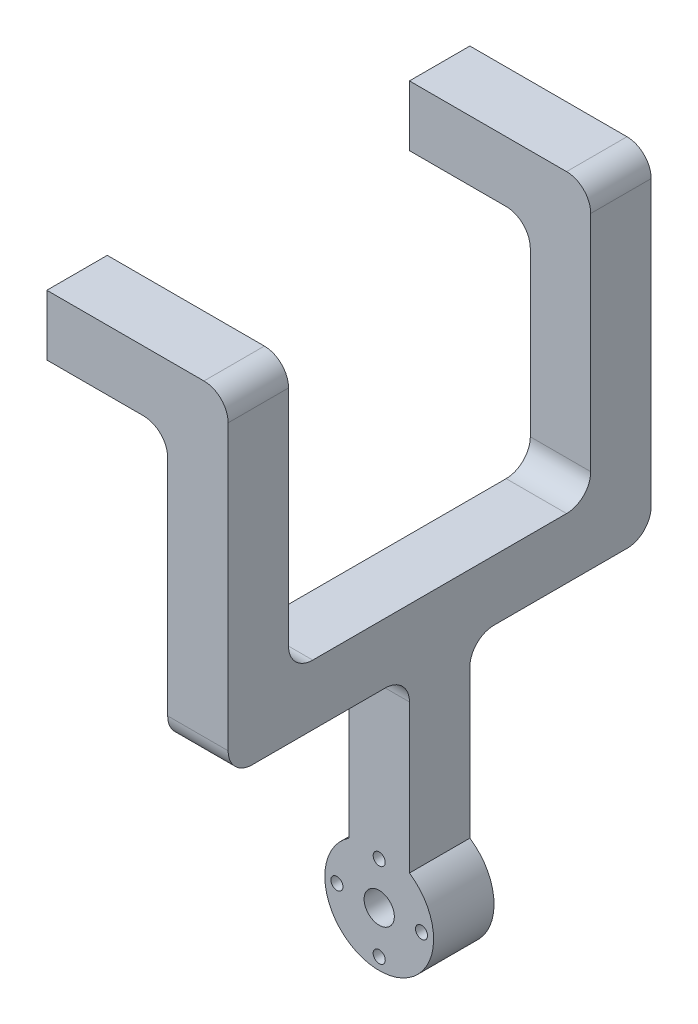
ISO-10303-21;
HEADER;
FILE_DESCRIPTION(('STEP AP214'),'2;1');
FILE_NAME('part.step','',(''),(''),'','','');
FILE_SCHEMA(('AUTOMOTIVE_DESIGN { 1 0 10303 214 1 1 1 1 }'));
ENDSEC;
DATA;
#1=APPLICATION_CONTEXT('core data for automotive mechanical design processes');
#2=APPLICATION_PROTOCOL_DEFINITION('international standard','automotive_design',2000,#1);
#3=PRODUCT_CONTEXT('',#1,'mechanical');
#4=PRODUCT('Part','Part','',(#3));
#5=PRODUCT_RELATED_PRODUCT_CATEGORY('part','',(#4));
#6=PRODUCT_DEFINITION_FORMATION('','',#4);
#7=PRODUCT_DEFINITION_CONTEXT('part definition',#1,'design');
#8=PRODUCT_DEFINITION('design','',#6,#7);
#9=PRODUCT_DEFINITION_SHAPE('','',#8);
#10=(LENGTH_UNIT() NAMED_UNIT(*) SI_UNIT(.MILLI.,.METRE.));
#11=(NAMED_UNIT(*) PLANE_ANGLE_UNIT() SI_UNIT($,.RADIAN.));
#12=(NAMED_UNIT(*) SI_UNIT($,.STERADIAN.) SOLID_ANGLE_UNIT());
#13=UNCERTAINTY_MEASURE_WITH_UNIT(LENGTH_MEASURE(1.E-05),#10,'distance_accuracy_value','');
#14=(GEOMETRIC_REPRESENTATION_CONTEXT(3) GLOBAL_UNCERTAINTY_ASSIGNED_CONTEXT((#13)) GLOBAL_UNIT_ASSIGNED_CONTEXT((#10,
#11,#12)) REPRESENTATION_CONTEXT('',''));
#15=CARTESIAN_POINT('',(0.,0.,0.));
#16=DIRECTION('',(0.,0.,1.));
#17=DIRECTION('',(1.,0.,0.));
#18=AXIS2_PLACEMENT_3D('',#15,#16,#17);
#19=CARTESIAN_POINT('',(4.,55.,10.));
#20=DIRECTION('',(1.,0.,0.));
#21=DIRECTION('',(0.,1.,0.));
#22=AXIS2_PLACEMENT_3D('',#19,#20,#21);
#23=PLANE('',#22);
#24=DIRECTION('',(0.,-1.,0.));
#25=VECTOR('',#24,1.);
#26=CARTESIAN_POINT('',(4.,55.,-20.));
#27=LINE('',#26,#25);
#28=CARTESIAN_POINT('',(4.,86.,-20.));
#29=VERTEX_POINT('',#28);
#30=CARTESIAN_POINT('',(4.,59.,-20.));
#31=VERTEX_POINT('',#30);
#32=EDGE_CURVE('E273',#29,#31,#27,.T.);
#33=ORIENTED_EDGE('',*,*,#32,.F.);
#34=DIRECTION('',(0.,0.,1.));
#35=VECTOR('',#34,1.);
#36=CARTESIAN_POINT('',(4.,86.,-30.));
#37=LINE('',#36,#35);
#38=CARTESIAN_POINT('',(4.,86.,-30.));
#39=VERTEX_POINT('',#38);
#40=EDGE_CURVE('E434',#29,#39,#37,.F.);
#41=ORIENTED_EDGE('',*,*,#40,.T.);
#42=DIRECTION('',(0.,1.,0.));
#43=VECTOR('',#42,1.);
#44=CARTESIAN_POINT('',(4.,100.,-30.));
#45=LINE('',#44,#43);
#46=CARTESIAN_POINT('',(4.,49.,-30.));
#47=VERTEX_POINT('',#46);
#48=EDGE_CURVE('E290',#47,#39,#45,.T.);
#49=ORIENTED_EDGE('',*,*,#48,.F.);
#50=CARTESIAN_POINT('',(4.,49.,-26.));
#51=DIRECTION('',(1.,0.,0.));
#52=DIRECTION('',(0.,1.,0.));
#53=AXIS2_PLACEMENT_3D('',#50,#51,#52);
#54=CIRCLE('',#53,4.);
#55=CARTESIAN_POINT('',(4.,45.,-26.));
#56=VERTEX_POINT('',#55);
#57=EDGE_CURVE('E428',#47,#56,#54,.F.);
#58=ORIENTED_EDGE('',*,*,#57,.T.);
#59=DIRECTION('',(0.,0.,-1.));
#60=VECTOR('',#59,1.);
#61=CARTESIAN_POINT('',(4.,45.,-30.));
#62=LINE('',#61,#60);
#63=CARTESIAN_POINT('',(4.,45.,-4.));
#64=VERTEX_POINT('',#63);
#65=EDGE_CURVE('E285',#64,#56,#62,.T.);
#66=ORIENTED_EDGE('',*,*,#65,.F.);
#67=CARTESIAN_POINT('',(4.,41.,-4.));
#68=DIRECTION('',(1.,0.,0.));
#69=DIRECTION('',(0.,1.,0.));
#70=AXIS2_PLACEMENT_3D('',#67,#68,#69);
#71=CIRCLE('',#70,4.);
#72=CARTESIAN_POINT('',(4.,41.,0.));
#73=VERTEX_POINT('',#72);
#74=EDGE_CURVE('E518',#64,#73,#71,.T.);
#75=ORIENTED_EDGE('',*,*,#74,.T.);
#76=DIRECTION('',(0.,-1.,0.));
#77=VECTOR('',#76,1.);
#78=CARTESIAN_POINT('',(4.,55.,0.));
#79=LINE('',#78,#77);
#80=CARTESIAN_POINT('',(4.,16.4833147735479,0.));
#81=VERTEX_POINT('',#80);
#82=EDGE_CURVE('E362',#73,#81,#79,.T.);
#83=ORIENTED_EDGE('',*,*,#82,.T.);
#84=DIRECTION('',(0.,0.,-1.));
#85=VECTOR('',#84,1.);
#86=CARTESIAN_POINT('',(4.,16.4833147735479,10.));
#87=LINE('',#86,#85);
#88=CARTESIAN_POINT('',(4.,16.4833147735479,10.));
#89=VERTEX_POINT('',#88);
#90=EDGE_CURVE('E397',#89,#81,#87,.T.);
#91=ORIENTED_EDGE('',*,*,#90,.F.);
#92=DIRECTION('',(0.,-1.,0.));
#93=VECTOR('',#92,1.);
#94=CARTESIAN_POINT('',(4.,55.,10.));
#95=LINE('',#94,#93);
#96=CARTESIAN_POINT('',(4.,41.,10.));
#97=VERTEX_POINT('',#96);
#98=EDGE_CURVE('E366',#97,#89,#95,.T.);
#99=ORIENTED_EDGE('',*,*,#98,.F.);
#100=CARTESIAN_POINT('',(4.,41.,14.));
#101=DIRECTION('',(1.,0.,0.));
#102=DIRECTION('',(0.,1.,0.));
#103=AXIS2_PLACEMENT_3D('',#100,#101,#102);
#104=CIRCLE('',#103,4.);
#105=CARTESIAN_POINT('',(4.,45.,14.));
#106=VERTEX_POINT('',#105);
#107=EDGE_CURVE('E11',#97,#106,#104,.T.);
#108=ORIENTED_EDGE('',*,*,#107,.T.);
#109=CARTESIAN_POINT('',(4.,45.,36.));
#110=VERTEX_POINT('',#109);
#111=EDGE_CURVE('E286',#110,#106,#62,.T.);
#112=ORIENTED_EDGE('',*,*,#111,.F.);
#113=CARTESIAN_POINT('',(4.,49.,36.));
#114=DIRECTION('',(1.,0.,0.));
#115=DIRECTION('',(0.,1.,0.));
#116=AXIS2_PLACEMENT_3D('',#113,#114,#115);
#117=CIRCLE('',#116,4.);
#118=CARTESIAN_POINT('',(4.,49.,40.));
#119=VERTEX_POINT('',#118);
#120=EDGE_CURVE('E425',#110,#119,#117,.F.);
#121=ORIENTED_EDGE('',*,*,#120,.T.);
#122=DIRECTION('',(0.,-1.,0.));
#123=VECTOR('',#122,1.);
#124=CARTESIAN_POINT('',(4.,45.,40.));
#125=LINE('',#124,#123);
#126=CARTESIAN_POINT('',(4.,86.,40.));
#127=VERTEX_POINT('',#126);
#128=EDGE_CURVE('E281',#127,#119,#125,.T.);
#129=ORIENTED_EDGE('',*,*,#128,.F.);
#130=DIRECTION('',(0.,0.,1.));
#131=VECTOR('',#130,1.);
#132=CARTESIAN_POINT('',(4.,86.,30.));
#133=LINE('',#132,#131);
#134=CARTESIAN_POINT('',(4.,86.,30.));
#135=VERTEX_POINT('',#134);
#136=EDGE_CURVE('E431',#127,#135,#133,.F.);
#137=ORIENTED_EDGE('',*,*,#136,.T.);
#138=DIRECTION('',(0.,1.,0.));
#139=VECTOR('',#138,1.);
#140=CARTESIAN_POINT('',(4.,100.,30.));
#141=LINE('',#140,#139);
#142=CARTESIAN_POINT('',(4.,59.,30.));
#143=VERTEX_POINT('',#142);
#144=EDGE_CURVE('E277',#143,#135,#141,.T.);
#145=ORIENTED_EDGE('',*,*,#144,.F.);
#146=CARTESIAN_POINT('',(4.,59.,26.));
#147=DIRECTION('',(1.,0.,0.));
#148=DIRECTION('',(0.,1.,0.));
#149=AXIS2_PLACEMENT_3D('',#146,#147,#148);
#150=CIRCLE('',#149,4.);
#151=CARTESIAN_POINT('',(4.,55.,26.));
#152=VERTEX_POINT('',#151);
#153=EDGE_CURVE('E501',#143,#152,#150,.T.);
#154=ORIENTED_EDGE('',*,*,#153,.T.);
#155=DIRECTION('',(0.,0.,-1.));
#156=VECTOR('',#155,1.);
#157=CARTESIAN_POINT('',(4.,55.,10.));
#158=LINE('',#157,#156);
#159=CARTESIAN_POINT('',(4.,55.,-16.));
#160=VERTEX_POINT('',#159);
#161=EDGE_CURVE('E377',#152,#160,#158,.T.);
#162=ORIENTED_EDGE('',*,*,#161,.T.);
#163=CARTESIAN_POINT('',(4.,59.,-16.));
#164=DIRECTION('',(1.,0.,0.));
#165=DIRECTION('',(0.,1.,0.));
#166=AXIS2_PLACEMENT_3D('',#163,#164,#165);
#167=CIRCLE('',#166,4.);
#168=EDGE_CURVE('E495',#160,#31,#167,.T.);
#169=ORIENTED_EDGE('',*,*,#168,.T.);
#170=EDGE_LOOP('',(#33,#41,#49,#58,#66,#75,#83,#91,#99,#108,#112,#121,#129,#137,#145,#154,#162,#169));
#171=FACE_BOUND('',#170,.T.);
#172=ADVANCED_FACE('F39',(#171),#23,.F.);
#173=CARTESIAN_POINT('',(9.,9.,10.));
#174=DIRECTION('',(0.,0.,1.));
#175=DIRECTION('',(1.,0.,0.));
#176=AXIS2_PLACEMENT_3D('',#173,#174,#175);
#177=PLANE('',#176);
#178=DIRECTION('',(0.,1.,0.));
#179=VECTOR('',#178,1.);
#180=CARTESIAN_POINT('',(14.,55.,10.));
#181=LINE('',#180,#179);
#182=CARTESIAN_POINT('',(14.,16.4833147735479,10.));
#183=VERTEX_POINT('',#182);
#184=CARTESIAN_POINT('',(14.,41.,10.));
#185=VERTEX_POINT('',#184);
#186=EDGE_CURVE('E373',#183,#185,#181,.T.);
#187=ORIENTED_EDGE('',*,*,#186,.T.);
#188=DIRECTION('',(1.,0.,0.));
#189=VECTOR('',#188,1.);
#190=CARTESIAN_POINT('',(4.,41.,10.));
#191=LINE('',#190,#189);
#192=EDGE_CURVE('E489',#185,#97,#191,.F.);
#193=ORIENTED_EDGE('',*,*,#192,.T.);
#194=ORIENTED_EDGE('',*,*,#98,.T.);
#195=CARTESIAN_POINT('',(9.,9.,10.));
#196=DIRECTION('',(0.,0.,1.));
#197=DIRECTION('',(1.,0.,0.));
#198=AXIS2_PLACEMENT_3D('',#195,#196,#197);
#199=CIRCLE('',#198,9.);
#200=EDGE_CURVE('E369',#89,#183,#199,.T.);
#201=ORIENTED_EDGE('',*,*,#200,.T.);
#202=EDGE_LOOP('',(#187,#193,#194,#201));
#203=FACE_BOUND('',#202,.T.);
#204=CARTESIAN_POINT('',(9.00000000000035,2.,10.));
#205=DIRECTION('',(0.,0.,1.));
#206=DIRECTION('',(1.,0.,0.));
#207=AXIS2_PLACEMENT_3D('',#204,#205,#206);
#208=CIRCLE('',#207,1.);
#209=CARTESIAN_POINT('',(10.0000000000003,2.,10.));
#210=VERTEX_POINT('',#209);
#211=EDGE_CURVE('E334',#210,#210,#208,.T.);
#212=ORIENTED_EDGE('',*,*,#211,.F.);
#213=EDGE_LOOP('',(#212));
#214=FACE_BOUND('',#213,.T.);
#215=CARTESIAN_POINT('',(9.,9.,10.));
#216=DIRECTION('',(0.,0.,1.));
#217=DIRECTION('',(1.,0.,0.));
#218=AXIS2_PLACEMENT_3D('',#215,#216,#217);
#219=CIRCLE('',#218,2.5);
#220=CARTESIAN_POINT('',(11.5,9.,10.));
#221=VERTEX_POINT('',#220);
#222=EDGE_CURVE('E350',#221,#221,#219,.T.);
#223=ORIENTED_EDGE('',*,*,#222,.F.);
#224=EDGE_LOOP('',(#223));
#225=FACE_BOUND('',#224,.T.);
#226=CARTESIAN_POINT('',(9.,16.,10.));
#227=DIRECTION('',(0.,0.,1.));
#228=DIRECTION('',(1.,0.,0.));
#229=AXIS2_PLACEMENT_3D('',#226,#227,#228);
#230=CIRCLE('',#229,1.);
#231=CARTESIAN_POINT('',(10.,16.,10.));
#232=VERTEX_POINT('',#231);
#233=EDGE_CURVE('E358',#232,#232,#230,.T.);
#234=ORIENTED_EDGE('',*,*,#233,.F.);
#235=EDGE_LOOP('',(#234));
#236=FACE_BOUND('',#235,.T.);
#237=CARTESIAN_POINT('',(16.0000000000002,9.00000000000018,10.));
#238=DIRECTION('',(0.,0.,1.));
#239=DIRECTION('',(1.,0.,0.));
#240=AXIS2_PLACEMENT_3D('',#237,#238,#239);
#241=CIRCLE('',#240,1.);
#242=CARTESIAN_POINT('',(17.0000000000002,9.00000000000018,10.));
#243=VERTEX_POINT('',#242);
#244=EDGE_CURVE('E342',#243,#243,#241,.T.);
#245=ORIENTED_EDGE('',*,*,#244,.F.);
#246=EDGE_LOOP('',(#245));
#247=FACE_BOUND('',#246,.T.);
#248=CARTESIAN_POINT('',(2.0000000000002,8.99999999999988,10.));
#249=DIRECTION('',(0.,0.,1.));
#250=DIRECTION('',(1.,0.,0.));
#251=AXIS2_PLACEMENT_3D('',#248,#249,#250);
#252=CIRCLE('',#251,0.999999999999999);
#253=CARTESIAN_POINT('',(3.00000000000019,8.99999999999988,10.));
#254=VERTEX_POINT('',#253);
#255=EDGE_CURVE('E326',#254,#254,#252,.T.);
#256=ORIENTED_EDGE('',*,*,#255,.F.);
#257=EDGE_LOOP('',(#256));
#258=FACE_BOUND('',#257,.T.);
#259=ADVANCED_FACE('F530',(#203,#214,#225,#236,#247,#258),#177,.T.);
#260=CARTESIAN_POINT('',(9.,9.,0.));
#261=DIRECTION('',(0.,0.,1.));
#262=DIRECTION('',(1.,0.,0.));
#263=AXIS2_PLACEMENT_3D('',#260,#261,#262);
#264=PLANE('',#263);
#265=ORIENTED_EDGE('',*,*,#82,.F.);
#266=DIRECTION('',(1.,0.,0.));
#267=VECTOR('',#266,1.);
#268=CARTESIAN_POINT('',(9.,41.,0.));
#269=LINE('',#268,#267);
#270=CARTESIAN_POINT('',(14.,41.,0.));
#271=VERTEX_POINT('',#270);
#272=EDGE_CURVE('E485',#73,#271,#269,.T.);
#273=ORIENTED_EDGE('',*,*,#272,.T.);
#274=DIRECTION('',(0.,1.,0.));
#275=VECTOR('',#274,1.);
#276=CARTESIAN_POINT('',(14.,55.,0.));
#277=LINE('',#276,#275);
#278=CARTESIAN_POINT('',(14.,16.4833147735479,0.));
#279=VERTEX_POINT('',#278);
#280=EDGE_CURVE('E370',#279,#271,#277,.T.);
#281=ORIENTED_EDGE('',*,*,#280,.F.);
#282=CARTESIAN_POINT('',(9.,9.,0.));
#283=DIRECTION('',(0.,0.,1.));
#284=DIRECTION('',(1.,0.,0.));
#285=AXIS2_PLACEMENT_3D('',#282,#283,#284);
#286=CIRCLE('',#285,9.);
#287=EDGE_CURVE('E380',#81,#279,#286,.T.);
#288=ORIENTED_EDGE('',*,*,#287,.F.);
#289=EDGE_LOOP('',(#265,#273,#281,#288));
#290=FACE_BOUND('',#289,.T.);
#291=CARTESIAN_POINT('',(9.,16.,0.));
#292=DIRECTION('',(0.,0.,1.));
#293=DIRECTION('',(1.,0.,0.));
#294=AXIS2_PLACEMENT_3D('',#291,#292,#293);
#295=CIRCLE('',#294,1.);
#296=CARTESIAN_POINT('',(10.,16.,0.));
#297=VERTEX_POINT('',#296);
#298=EDGE_CURVE('E354',#297,#297,#295,.T.);
#299=ORIENTED_EDGE('',*,*,#298,.T.);
#300=EDGE_LOOP('',(#299));
#301=FACE_BOUND('',#300,.T.);
#302=CARTESIAN_POINT('',(9.,9.,0.));
#303=DIRECTION('',(0.,0.,1.));
#304=DIRECTION('',(1.,0.,0.));
#305=AXIS2_PLACEMENT_3D('',#302,#303,#304);
#306=CIRCLE('',#305,2.5);
#307=CARTESIAN_POINT('',(11.5,9.,0.));
#308=VERTEX_POINT('',#307);
#309=EDGE_CURVE('E346',#308,#308,#306,.T.);
#310=ORIENTED_EDGE('',*,*,#309,.T.);
#311=EDGE_LOOP('',(#310));
#312=FACE_BOUND('',#311,.T.);
#313=CARTESIAN_POINT('',(16.0000000000002,9.00000000000018,0.));
#314=DIRECTION('',(0.,0.,1.));
#315=DIRECTION('',(1.,0.,0.));
#316=AXIS2_PLACEMENT_3D('',#313,#314,#315);
#317=CIRCLE('',#316,1.);
#318=CARTESIAN_POINT('',(17.0000000000002,9.00000000000018,0.));
#319=VERTEX_POINT('',#318);
#320=EDGE_CURVE('E338',#319,#319,#317,.T.);
#321=ORIENTED_EDGE('',*,*,#320,.T.);
#322=EDGE_LOOP('',(#321));
#323=FACE_BOUND('',#322,.T.);
#324=CARTESIAN_POINT('',(9.00000000000035,2.,0.));
#325=DIRECTION('',(0.,0.,1.));
#326=DIRECTION('',(1.,0.,0.));
#327=AXIS2_PLACEMENT_3D('',#324,#325,#326);
#328=CIRCLE('',#327,1.);
#329=CARTESIAN_POINT('',(10.0000000000003,2.,0.));
#330=VERTEX_POINT('',#329);
#331=EDGE_CURVE('E330',#330,#330,#328,.T.);
#332=ORIENTED_EDGE('',*,*,#331,.T.);
#333=EDGE_LOOP('',(#332));
#334=FACE_BOUND('',#333,.T.);
#335=CARTESIAN_POINT('',(2.0000000000002,8.99999999999988,0.));
#336=DIRECTION('',(0.,0.,1.));
#337=DIRECTION('',(1.,0.,0.));
#338=AXIS2_PLACEMENT_3D('',#335,#336,#337);
#339=CIRCLE('',#338,0.999999999999999);
#340=CARTESIAN_POINT('',(3.00000000000019,8.99999999999988,0.));
#341=VERTEX_POINT('',#340);
#342=EDGE_CURVE('E317',#341,#341,#339,.T.);
#343=ORIENTED_EDGE('',*,*,#342,.T.);
#344=EDGE_LOOP('',(#343));
#345=FACE_BOUND('',#344,.T.);
#346=ADVANCED_FACE('F605',(#290,#301,#312,#323,#334,#345),#264,.F.);
#347=CARTESIAN_POINT('',(9.,9.,10.));
#348=DIRECTION('',(0.,0.,-1.));
#349=DIRECTION('',(-1.,0.,0.));
#350=AXIS2_PLACEMENT_3D('',#347,#348,#349);
#351=CYLINDRICAL_SURFACE('',#350,9.);
#352=ORIENTED_EDGE('',*,*,#287,.T.);
#353=DIRECTION('',(0.,0.,-1.));
#354=VECTOR('',#353,1.);
#355=CARTESIAN_POINT('',(14.,16.4833147735479,10.));
#356=LINE('',#355,#354);
#357=EDGE_CURVE('E393',#183,#279,#356,.T.);
#358=ORIENTED_EDGE('',*,*,#357,.F.);
#359=ORIENTED_EDGE('',*,*,#200,.F.);
#360=ORIENTED_EDGE('',*,*,#90,.T.);
#361=EDGE_LOOP('',(#352,#358,#359,#360));
#362=FACE_BOUND('',#361,.T.);
#363=ADVANCED_FACE('F609',(#362),#351,.T.);
#364=CARTESIAN_POINT('',(14.,55.,10.));
#365=DIRECTION('',(-1.,0.,0.));
#366=DIRECTION('',(0.,-1.,0.));
#367=AXIS2_PLACEMENT_3D('',#364,#365,#366);
#368=PLANE('',#367);
#369=DIRECTION('',(0.,0.,-1.));
#370=VECTOR('',#369,1.);
#371=CARTESIAN_POINT('',(14.,45.,-30.));
#372=LINE('',#371,#370);
#373=CARTESIAN_POINT('',(14.,45.,-4.));
#374=VERTEX_POINT('',#373);
#375=CARTESIAN_POINT('',(14.,45.,-26.));
#376=VERTEX_POINT('',#375);
#377=EDGE_CURVE('E306',#374,#376,#372,.T.);
#378=ORIENTED_EDGE('',*,*,#377,.T.);
#379=CARTESIAN_POINT('',(14.,49.,-26.));
#380=DIRECTION('',(-1.,0.,0.));
#381=DIRECTION('',(0.,-1.,0.));
#382=AXIS2_PLACEMENT_3D('',#379,#380,#381);
#383=CIRCLE('',#382,4.);
#384=CARTESIAN_POINT('',(14.,49.,-30.));
#385=VERTEX_POINT('',#384);
#386=EDGE_CURVE('E458',#376,#385,#383,.F.);
#387=ORIENTED_EDGE('',*,*,#386,.T.);
#388=DIRECTION('',(0.,1.,0.));
#389=VECTOR('',#388,1.);
#390=CARTESIAN_POINT('',(14.,100.,-30.));
#391=LINE('',#390,#389);
#392=CARTESIAN_POINT('',(14.,96.,-30.));
#393=VERTEX_POINT('',#392);
#394=EDGE_CURVE('E278',#385,#393,#391,.T.);
#395=ORIENTED_EDGE('',*,*,#394,.T.);
#396=DIRECTION('',(0.,0.,1.));
#397=VECTOR('',#396,1.);
#398=CARTESIAN_POINT('',(14.,96.,-20.));
#399=LINE('',#398,#397);
#400=CARTESIAN_POINT('',(14.,96.,-20.));
#401=VERTEX_POINT('',#400);
#402=EDGE_CURVE('E451',#393,#401,#399,.T.);
#403=ORIENTED_EDGE('',*,*,#402,.T.);
#404=DIRECTION('',(0.,-1.,0.));
#405=VECTOR('',#404,1.);
#406=CARTESIAN_POINT('',(14.,55.,-20.));
#407=LINE('',#406,#405);
#408=CARTESIAN_POINT('',(14.,59.,-20.));
#409=VERTEX_POINT('',#408);
#410=EDGE_CURVE('E272',#401,#409,#407,.T.);
#411=ORIENTED_EDGE('',*,*,#410,.T.);
#412=CARTESIAN_POINT('',(14.,59.,-16.));
#413=DIRECTION('',(-1.,0.,0.));
#414=DIRECTION('',(0.,-1.,0.));
#415=AXIS2_PLACEMENT_3D('',#412,#413,#414);
#416=CIRCLE('',#415,4.);
#417=CARTESIAN_POINT('',(14.,55.,-16.));
#418=VERTEX_POINT('',#417);
#419=EDGE_CURVE('E492',#409,#418,#416,.T.);
#420=ORIENTED_EDGE('',*,*,#419,.T.);
#421=DIRECTION('',(0.,0.,-1.));
#422=VECTOR('',#421,1.);
#423=CARTESIAN_POINT('',(14.,55.,10.));
#424=LINE('',#423,#422);
#425=CARTESIAN_POINT('',(14.,55.,26.));
#426=VERTEX_POINT('',#425);
#427=EDGE_CURVE('E389',#426,#418,#424,.T.);
#428=ORIENTED_EDGE('',*,*,#427,.F.);
#429=CARTESIAN_POINT('',(14.,59.,26.));
#430=DIRECTION('',(-1.,0.,0.));
#431=DIRECTION('',(0.,-1.,0.));
#432=AXIS2_PLACEMENT_3D('',#429,#430,#431);
#433=CIRCLE('',#432,4.);
#434=CARTESIAN_POINT('',(14.,59.,30.));
#435=VERTEX_POINT('',#434);
#436=EDGE_CURVE('E498',#426,#435,#433,.T.);
#437=ORIENTED_EDGE('',*,*,#436,.T.);
#438=DIRECTION('',(0.,1.,0.));
#439=VECTOR('',#438,1.);
#440=CARTESIAN_POINT('',(14.,100.,30.));
#441=LINE('',#440,#439);
#442=CARTESIAN_POINT('',(14.,96.,30.));
#443=VERTEX_POINT('',#442);
#444=EDGE_CURVE('E298',#435,#443,#441,.T.);
#445=ORIENTED_EDGE('',*,*,#444,.T.);
#446=DIRECTION('',(0.,0.,1.));
#447=VECTOR('',#446,1.);
#448=CARTESIAN_POINT('',(14.,96.,40.));
#449=LINE('',#448,#447);
#450=CARTESIAN_POINT('',(14.,96.,40.));
#451=VERTEX_POINT('',#450);
#452=EDGE_CURVE('E447',#443,#451,#449,.T.);
#453=ORIENTED_EDGE('',*,*,#452,.T.);
#454=DIRECTION('',(0.,-1.,0.));
#455=VECTOR('',#454,1.);
#456=CARTESIAN_POINT('',(14.,45.,40.));
#457=LINE('',#456,#455);
#458=CARTESIAN_POINT('',(14.,49.,40.));
#459=VERTEX_POINT('',#458);
#460=EDGE_CURVE('E302',#451,#459,#457,.T.);
#461=ORIENTED_EDGE('',*,*,#460,.T.);
#462=CARTESIAN_POINT('',(14.,49.,36.));
#463=DIRECTION('',(-1.,0.,0.));
#464=DIRECTION('',(0.,-1.,0.));
#465=AXIS2_PLACEMENT_3D('',#462,#463,#464);
#466=CIRCLE('',#465,4.);
#467=CARTESIAN_POINT('',(14.,45.,36.));
#468=VERTEX_POINT('',#467);
#469=EDGE_CURVE('E455',#459,#468,#466,.F.);
#470=ORIENTED_EDGE('',*,*,#469,.T.);
#471=CARTESIAN_POINT('',(14.,45.,14.));
#472=VERTEX_POINT('',#471);
#473=EDGE_CURVE('E307',#468,#472,#372,.T.);
#474=ORIENTED_EDGE('',*,*,#473,.T.);
#475=CARTESIAN_POINT('',(14.,41.,14.));
#476=DIRECTION('',(-1.,0.,0.));
#477=DIRECTION('',(0.,-1.,0.));
#478=AXIS2_PLACEMENT_3D('',#475,#476,#477);
#479=CIRCLE('',#478,4.);
#480=EDGE_CURVE('E48',#472,#185,#479,.T.);
#481=ORIENTED_EDGE('',*,*,#480,.T.);
#482=ORIENTED_EDGE('',*,*,#186,.F.);
#483=ORIENTED_EDGE('',*,*,#357,.T.);
#484=ORIENTED_EDGE('',*,*,#280,.T.);
#485=CARTESIAN_POINT('',(14.,41.,-4.));
#486=DIRECTION('',(-1.,0.,0.));
#487=DIRECTION('',(0.,-1.,0.));
#488=AXIS2_PLACEMENT_3D('',#485,#486,#487);
#489=CIRCLE('',#488,4.);
#490=EDGE_CURVE('E515',#271,#374,#489,.T.);
#491=ORIENTED_EDGE('',*,*,#490,.T.);
#492=EDGE_LOOP('',(#378,#387,#395,#403,#411,#420,#428,#437,#445,#453,#461,#470,#474,#481,#482,
#483,#484,#491));
#493=FACE_BOUND('',#492,.T.);
#494=ADVANCED_FACE('F524',(#493),#368,.F.);
#495=CARTESIAN_POINT('',(4.,55.,10.));
#496=DIRECTION('',(0.,-1.,0.));
#497=DIRECTION('',(0.,0.,-1.));
#498=AXIS2_PLACEMENT_3D('',#495,#496,#497);
#499=PLANE('',#498);
#500=ORIENTED_EDGE('',*,*,#427,.T.);
#501=DIRECTION('',(1.,0.,0.));
#502=VECTOR('',#501,1.);
#503=CARTESIAN_POINT('',(4.,55.,-16.));
#504=LINE('',#503,#502);
#505=EDGE_CURVE('E412',#418,#160,#504,.F.);
#506=ORIENTED_EDGE('',*,*,#505,.T.);
#507=ORIENTED_EDGE('',*,*,#161,.F.);
#508=DIRECTION('',(1.,0.,0.));
#509=VECTOR('',#508,1.);
#510=CARTESIAN_POINT('',(4.,55.,26.));
#511=LINE('',#510,#509);
#512=EDGE_CURVE('E408',#152,#426,#511,.T.);
#513=ORIENTED_EDGE('',*,*,#512,.T.);
#514=EDGE_LOOP('',(#500,#506,#507,#513));
#515=FACE_BOUND('',#514,.T.);
#516=ADVANCED_FACE('F561',(#515),#499,.F.);
#517=CARTESIAN_POINT('',(9.,16.,10.));
#518=DIRECTION('',(0.,0.,-1.));
#519=DIRECTION('',(-1.,0.,0.));
#520=AXIS2_PLACEMENT_3D('',#517,#518,#519);
#521=CYLINDRICAL_SURFACE('',#520,1.);
#522=ORIENTED_EDGE('',*,*,#233,.T.);
#523=EDGE_LOOP('',(#522));
#524=FACE_BOUND('',#523,.T.);
#525=ORIENTED_EDGE('',*,*,#298,.F.);
#526=EDGE_LOOP('',(#525));
#527=FACE_BOUND('',#526,.T.);
#528=ADVANCED_FACE('F807',(#524,#527),#521,.F.);
#529=CARTESIAN_POINT('',(9.,9.,10.));
#530=DIRECTION('',(0.,0.,-1.));
#531=DIRECTION('',(-1.,0.,0.));
#532=AXIS2_PLACEMENT_3D('',#529,#530,#531);
#533=CYLINDRICAL_SURFACE('',#532,2.5);
#534=ORIENTED_EDGE('',*,*,#222,.T.);
#535=EDGE_LOOP('',(#534));
#536=FACE_BOUND('',#535,.T.);
#537=ORIENTED_EDGE('',*,*,#309,.F.);
#538=EDGE_LOOP('',(#537));
#539=FACE_BOUND('',#538,.T.);
#540=ADVANCED_FACE('F874',(#536,#539),#533,.F.);
#541=CARTESIAN_POINT('',(16.0000000000002,9.00000000000018,10.));
#542=DIRECTION('',(0.,0.,-1.));
#543=DIRECTION('',(-1.,0.,0.));
#544=AXIS2_PLACEMENT_3D('',#541,#542,#543);
#545=CYLINDRICAL_SURFACE('',#544,1.);
#546=ORIENTED_EDGE('',*,*,#244,.T.);
#547=EDGE_LOOP('',(#546));
#548=FACE_BOUND('',#547,.T.);
#549=ORIENTED_EDGE('',*,*,#320,.F.);
#550=EDGE_LOOP('',(#549));
#551=FACE_BOUND('',#550,.T.);
#552=ADVANCED_FACE('F864',(#548,#551),#545,.F.);
#553=CARTESIAN_POINT('',(9.00000000000035,2.,10.));
#554=DIRECTION('',(0.,0.,-1.));
#555=DIRECTION('',(-1.,0.,0.));
#556=AXIS2_PLACEMENT_3D('',#553,#554,#555);
#557=CYLINDRICAL_SURFACE('',#556,1.);
#558=ORIENTED_EDGE('',*,*,#211,.T.);
#559=EDGE_LOOP('',(#558));
#560=FACE_BOUND('',#559,.T.);
#561=ORIENTED_EDGE('',*,*,#331,.F.);
#562=EDGE_LOOP('',(#561));
#563=FACE_BOUND('',#562,.T.);
#564=ADVANCED_FACE('F854',(#560,#563),#557,.F.);
#565=CARTESIAN_POINT('',(2.0000000000002,8.99999999999988,10.));
#566=DIRECTION('',(0.,0.,-1.));
#567=DIRECTION('',(-1.,0.,0.));
#568=AXIS2_PLACEMENT_3D('',#565,#566,#567);
#569=CYLINDRICAL_SURFACE('',#568,0.999999999999999);
#570=ORIENTED_EDGE('',*,*,#255,.T.);
#571=EDGE_LOOP('',(#570));
#572=FACE_BOUND('',#571,.T.);
#573=ORIENTED_EDGE('',*,*,#342,.F.);
#574=EDGE_LOOP('',(#573));
#575=FACE_BOUND('',#574,.T.);
#576=ADVANCED_FACE('F795',(#572,#575),#569,.F.);
#577=CARTESIAN_POINT('',(4.,55.,-20.));
#578=DIRECTION('',(0.,0.,1.));
#579=DIRECTION('',(0.,-1.,0.));
#580=AXIS2_PLACEMENT_3D('',#577,#578,#579);
#581=PLANE('',#580);
#582=ORIENTED_EDGE('',*,*,#32,.T.);
#583=DIRECTION('',(1.,0.,0.));
#584=VECTOR('',#583,1.);
#585=CARTESIAN_POINT('',(4.,59.,-20.));
#586=LINE('',#585,#584);
#587=EDGE_CURVE('E404',#31,#409,#586,.T.);
#588=ORIENTED_EDGE('',*,*,#587,.T.);
#589=ORIENTED_EDGE('',*,*,#410,.F.);
#590=CARTESIAN_POINT('',(10.,96.,-20.));
#591=DIRECTION('',(0.,0.,1.));
#592=DIRECTION('',(0.,-1.,0.));
#593=AXIS2_PLACEMENT_3D('',#590,#591,#592);
#594=CIRCLE('',#593,4.);
#595=CARTESIAN_POINT('',(10.,100.,-20.));
#596=VERTEX_POINT('',#595);
#597=EDGE_CURVE('E401',#401,#596,#594,.T.);
#598=ORIENTED_EDGE('',*,*,#597,.T.);
#599=DIRECTION('',(1.,0.,0.));
#600=VECTOR('',#599,1.);
#601=CARTESIAN_POINT('',(4.,100.,-20.));
#602=LINE('',#601,#600);
#603=CARTESIAN_POINT('',(-16.,100.,-20.));
#604=VERTEX_POINT('',#603);
#605=EDGE_CURVE('E314',#604,#596,#602,.T.);
#606=ORIENTED_EDGE('',*,*,#605,.F.);
#607=DIRECTION('',(0.,1.,0.));
#608=VECTOR('',#607,1.);
#609=CARTESIAN_POINT('',(-16.,100.,-20.));
#610=LINE('',#609,#608);
#611=CARTESIAN_POINT('',(-16.,90.,-20.));
#612=VERTEX_POINT('',#611);
#613=EDGE_CURVE('E256',#612,#604,#610,.T.);
#614=ORIENTED_EDGE('',*,*,#613,.F.);
#615=DIRECTION('',(1.,0.,0.));
#616=VECTOR('',#615,1.);
#617=CARTESIAN_POINT('',(-16.,90.,-20.));
#618=LINE('',#617,#616);
#619=CARTESIAN_POINT('',(0.,90.,-20.));
#620=VERTEX_POINT('',#619);
#621=EDGE_CURVE('E264',#612,#620,#618,.T.);
#622=ORIENTED_EDGE('',*,*,#621,.T.);
#623=CARTESIAN_POINT('',(0.,86.,-20.));
#624=DIRECTION('',(0.,0.,1.));
#625=DIRECTION('',(0.,-1.,0.));
#626=AXIS2_PLACEMENT_3D('',#623,#624,#625);
#627=CIRCLE('',#626,4.);
#628=EDGE_CURVE('E504',#620,#29,#627,.F.);
#629=ORIENTED_EDGE('',*,*,#628,.T.);
#630=EDGE_LOOP('',(#582,#588,#589,#598,#606,#614,#622,#629));
#631=FACE_BOUND('',#630,.T.);
#632=ADVANCED_FACE('F569',(#631),#581,.T.);
#633=CARTESIAN_POINT('',(4.,100.,-20.));
#634=DIRECTION('',(0.,1.,0.));
#635=DIRECTION('',(-1.,0.,0.));
#636=AXIS2_PLACEMENT_3D('',#633,#634,#635);
#637=PLANE('',#636);
#638=ORIENTED_EDGE('',*,*,#605,.T.);
#639=DIRECTION('',(0.,0.,1.));
#640=VECTOR('',#639,1.);
#641=CARTESIAN_POINT('',(10.,100.,-30.));
#642=LINE('',#641,#640);
#643=CARTESIAN_POINT('',(10.,100.,-30.));
#644=VERTEX_POINT('',#643);
#645=EDGE_CURVE('E63',#596,#644,#642,.F.);
#646=ORIENTED_EDGE('',*,*,#645,.T.);
#647=DIRECTION('',(1.,0.,0.));
#648=VECTOR('',#647,1.);
#649=CARTESIAN_POINT('',(4.,100.,-30.));
#650=LINE('',#649,#648);
#651=CARTESIAN_POINT('',(-16.,100.,-30.));
#652=VERTEX_POINT('',#651);
#653=EDGE_CURVE('E318',#652,#644,#650,.T.);
#654=ORIENTED_EDGE('',*,*,#653,.F.);
#655=DIRECTION('',(0.,0.,-1.));
#656=VECTOR('',#655,1.);
#657=CARTESIAN_POINT('',(-16.,100.,-30.));
#658=LINE('',#657,#656);
#659=EDGE_CURVE('E260',#604,#652,#658,.T.);
#660=ORIENTED_EDGE('',*,*,#659,.F.);
#661=EDGE_LOOP('',(#638,#646,#654,#660));
#662=FACE_BOUND('',#661,.T.);
#663=ADVANCED_FACE('F777',(#662),#637,.T.);
#664=CARTESIAN_POINT('',(4.,100.,-30.));
#665=DIRECTION('',(0.,0.,-1.));
#666=DIRECTION('',(0.,1.,0.));
#667=AXIS2_PLACEMENT_3D('',#664,#665,#666);
#668=PLANE('',#667);
#669=ORIENTED_EDGE('',*,*,#394,.F.);
#670=DIRECTION('',(1.,0.,0.));
#671=VECTOR('',#670,1.);
#672=CARTESIAN_POINT('',(4.,49.,-30.));
#673=LINE('',#672,#671);
#674=EDGE_CURVE('E464',#385,#47,#673,.F.);
#675=ORIENTED_EDGE('',*,*,#674,.T.);
#676=ORIENTED_EDGE('',*,*,#48,.T.);
#677=CARTESIAN_POINT('',(0.,86.,-30.));
#678=DIRECTION('',(0.,0.,-1.));
#679=DIRECTION('',(0.,1.,0.));
#680=AXIS2_PLACEMENT_3D('',#677,#678,#679);
#681=CIRCLE('',#680,4.);
#682=CARTESIAN_POINT('',(0.,90.,-30.));
#683=VERTEX_POINT('',#682);
#684=EDGE_CURVE('E507',#39,#683,#681,.F.);
#685=ORIENTED_EDGE('',*,*,#684,.T.);
#686=DIRECTION('',(1.,0.,0.));
#687=VECTOR('',#686,1.);
#688=CARTESIAN_POINT('',(-16.,90.,-30.));
#689=LINE('',#688,#687);
#690=CARTESIAN_POINT('',(-16.,90.,-30.));
#691=VERTEX_POINT('',#690);
#692=EDGE_CURVE('E268',#691,#683,#689,.T.);
#693=ORIENTED_EDGE('',*,*,#692,.F.);
#694=DIRECTION('',(0.,-1.,0.));
#695=VECTOR('',#694,1.);
#696=CARTESIAN_POINT('',(-16.,100.,-30.));
#697=LINE('',#696,#695);
#698=EDGE_CURVE('E244',#652,#691,#697,.T.);
#699=ORIENTED_EDGE('',*,*,#698,.F.);
#700=ORIENTED_EDGE('',*,*,#653,.T.);
#701=CARTESIAN_POINT('',(10.,96.,-30.));
#702=DIRECTION('',(0.,0.,-1.));
#703=DIRECTION('',(0.,1.,0.));
#704=AXIS2_PLACEMENT_3D('',#701,#702,#703);
#705=CIRCLE('',#704,4.);
#706=EDGE_CURVE('E461',#644,#393,#705,.T.);
#707=ORIENTED_EDGE('',*,*,#706,.T.);
#708=EDGE_LOOP('',(#669,#675,#676,#685,#693,#699,#700,#707));
#709=FACE_BOUND('',#708,.T.);
#710=ADVANCED_FACE('F583',(#709),#668,.T.);
#711=CARTESIAN_POINT('',(4.,45.,-30.));
#712=DIRECTION('',(0.,-1.,0.));
#713=DIRECTION('',(0.,0.,-1.));
#714=AXIS2_PLACEMENT_3D('',#711,#712,#713);
#715=PLANE('',#714);
#716=ORIENTED_EDGE('',*,*,#65,.T.);
#717=DIRECTION('',(1.,0.,0.));
#718=VECTOR('',#717,1.);
#719=CARTESIAN_POINT('',(4.,45.,-26.));
#720=LINE('',#719,#718);
#721=EDGE_CURVE('E443',#56,#376,#720,.T.);
#722=ORIENTED_EDGE('',*,*,#721,.T.);
#723=ORIENTED_EDGE('',*,*,#377,.F.);
#724=DIRECTION('',(1.,0.,0.));
#725=VECTOR('',#724,1.);
#726=CARTESIAN_POINT('',(4.,45.,-4.));
#727=LINE('',#726,#725);
#728=EDGE_CURVE('E440',#374,#64,#727,.F.);
#729=ORIENTED_EDGE('',*,*,#728,.T.);
#730=EDGE_LOOP('',(#716,#722,#723,#729));
#731=FACE_BOUND('',#730,.T.);
#732=ADVANCED_FACE('F594',(#731),#715,.T.);
#733=ORIENTED_EDGE('',*,*,#473,.F.);
#734=DIRECTION('',(1.,0.,0.));
#735=VECTOR('',#734,1.);
#736=CARTESIAN_POINT('',(4.,45.,36.));
#737=LINE('',#736,#735);
#738=EDGE_CURVE('E477',#468,#110,#737,.F.);
#739=ORIENTED_EDGE('',*,*,#738,.T.);
#740=ORIENTED_EDGE('',*,*,#111,.T.);
#741=DIRECTION('',(1.,0.,0.));
#742=VECTOR('',#741,1.);
#743=CARTESIAN_POINT('',(14.,45.,14.));
#744=LINE('',#743,#742);
#745=EDGE_CURVE('E473',#106,#472,#744,.T.);
#746=ORIENTED_EDGE('',*,*,#745,.T.);
#747=EDGE_LOOP('',(#733,#739,#740,#746));
#748=FACE_BOUND('',#747,.T.);
#749=ADVANCED_FACE('F542',(#748),#715,.T.);
#750=CARTESIAN_POINT('',(4.,45.,40.));
#751=DIRECTION('',(0.,0.,1.));
#752=DIRECTION('',(1.,0.,0.));
#753=AXIS2_PLACEMENT_3D('',#750,#751,#752);
#754=PLANE('',#753);
#755=ORIENTED_EDGE('',*,*,#128,.T.);
#756=DIRECTION('',(1.,0.,0.));
#757=VECTOR('',#756,1.);
#758=CARTESIAN_POINT('',(4.,49.,40.));
#759=LINE('',#758,#757);
#760=EDGE_CURVE('E469',#119,#459,#759,.T.);
#761=ORIENTED_EDGE('',*,*,#760,.T.);
#762=ORIENTED_EDGE('',*,*,#460,.F.);
#763=CARTESIAN_POINT('',(10.,96.,40.));
#764=DIRECTION('',(0.,0.,1.));
#765=DIRECTION('',(1.,0.,0.));
#766=AXIS2_PLACEMENT_3D('',#763,#764,#765);
#767=CIRCLE('',#766,4.);
#768=CARTESIAN_POINT('',(10.,100.,40.));
#769=VERTEX_POINT('',#768);
#770=EDGE_CURVE('E55',#451,#769,#767,.T.);
#771=ORIENTED_EDGE('',*,*,#770,.T.);
#772=DIRECTION('',(1.,0.,0.));
#773=VECTOR('',#772,1.);
#774=CARTESIAN_POINT('',(4.,100.,40.));
#775=LINE('',#774,#773);
#776=CARTESIAN_POINT('',(-16.,100.,40.));
#777=VERTEX_POINT('',#776);
#778=EDGE_CURVE('E321',#777,#769,#775,.T.);
#779=ORIENTED_EDGE('',*,*,#778,.F.);
#780=DIRECTION('',(0.,1.,0.));
#781=VECTOR('',#780,1.);
#782=CARTESIAN_POINT('',(-16.,100.,40.));
#783=LINE('',#782,#781);
#784=CARTESIAN_POINT('',(-16.,90.,40.));
#785=VERTEX_POINT('',#784);
#786=EDGE_CURVE('E226',#785,#777,#783,.T.);
#787=ORIENTED_EDGE('',*,*,#786,.F.);
#788=DIRECTION('',(1.,0.,0.));
#789=VECTOR('',#788,1.);
#790=CARTESIAN_POINT('',(-16.,90.,40.));
#791=LINE('',#790,#789);
#792=CARTESIAN_POINT('',(0.,90.,40.));
#793=VERTEX_POINT('',#792);
#794=EDGE_CURVE('E221',#785,#793,#791,.T.);
#795=ORIENTED_EDGE('',*,*,#794,.T.);
#796=CARTESIAN_POINT('',(0.,86.,40.));
#797=DIRECTION('',(0.,0.,1.));
#798=DIRECTION('',(1.,0.,0.));
#799=AXIS2_PLACEMENT_3D('',#796,#797,#798);
#800=CIRCLE('',#799,4.);
#801=EDGE_CURVE('E510',#793,#127,#800,.F.);
#802=ORIENTED_EDGE('',*,*,#801,.T.);
#803=EDGE_LOOP('',(#755,#761,#762,#771,#779,#787,#795,#802));
#804=FACE_BOUND('',#803,.T.);
#805=ADVANCED_FACE('F549',(#804),#754,.T.);
#806=CARTESIAN_POINT('',(4.,100.,40.));
#807=DIRECTION('',(0.,1.,0.));
#808=DIRECTION('',(0.,0.,1.));
#809=AXIS2_PLACEMENT_3D('',#806,#807,#808);
#810=PLANE('',#809);
#811=ORIENTED_EDGE('',*,*,#778,.T.);
#812=DIRECTION('',(0.,0.,1.));
#813=VECTOR('',#812,1.);
#814=CARTESIAN_POINT('',(10.,100.,30.));
#815=LINE('',#814,#813);
#816=CARTESIAN_POINT('',(10.,100.,30.));
#817=VERTEX_POINT('',#816);
#818=EDGE_CURVE('E482',#769,#817,#815,.F.);
#819=ORIENTED_EDGE('',*,*,#818,.T.);
#820=DIRECTION('',(1.,0.,0.));
#821=VECTOR('',#820,1.);
#822=CARTESIAN_POINT('',(4.,100.,30.));
#823=LINE('',#822,#821);
#824=CARTESIAN_POINT('',(-16.,100.,30.));
#825=VERTEX_POINT('',#824);
#826=EDGE_CURVE('E294',#825,#817,#823,.T.);
#827=ORIENTED_EDGE('',*,*,#826,.F.);
#828=DIRECTION('',(0.,0.,-1.));
#829=VECTOR('',#828,1.);
#830=CARTESIAN_POINT('',(-16.,100.,30.));
#831=LINE('',#830,#829);
#832=EDGE_CURVE('E233',#777,#825,#831,.T.);
#833=ORIENTED_EDGE('',*,*,#832,.F.);
#834=EDGE_LOOP('',(#811,#819,#827,#833));
#835=FACE_BOUND('',#834,.T.);
#836=ADVANCED_FACE('F732',(#835),#810,.T.);
#837=CARTESIAN_POINT('',(4.,100.,30.));
#838=DIRECTION('',(0.,0.,-1.));
#839=DIRECTION('',(-1.,0.,0.));
#840=AXIS2_PLACEMENT_3D('',#837,#838,#839);
#841=PLANE('',#840);
#842=ORIENTED_EDGE('',*,*,#444,.F.);
#843=DIRECTION('',(1.,0.,0.));
#844=VECTOR('',#843,1.);
#845=CARTESIAN_POINT('',(4.,59.,30.));
#846=LINE('',#845,#844);
#847=EDGE_CURVE('E418',#435,#143,#846,.F.);
#848=ORIENTED_EDGE('',*,*,#847,.T.);
#849=ORIENTED_EDGE('',*,*,#144,.T.);
#850=CARTESIAN_POINT('',(0.,86.,30.));
#851=DIRECTION('',(0.,0.,-1.));
#852=DIRECTION('',(-1.,0.,0.));
#853=AXIS2_PLACEMENT_3D('',#850,#851,#852);
#854=CIRCLE('',#853,4.);
#855=CARTESIAN_POINT('',(0.,90.,30.));
#856=VERTEX_POINT('',#855);
#857=EDGE_CURVE('E242',#135,#856,#854,.F.);
#858=ORIENTED_EDGE('',*,*,#857,.T.);
#859=DIRECTION('',(1.,0.,0.));
#860=VECTOR('',#859,1.);
#861=CARTESIAN_POINT('',(-16.,90.,30.));
#862=LINE('',#861,#860);
#863=CARTESIAN_POINT('',(-16.,90.,30.));
#864=VERTEX_POINT('',#863);
#865=EDGE_CURVE('E218',#864,#856,#862,.T.);
#866=ORIENTED_EDGE('',*,*,#865,.F.);
#867=DIRECTION('',(0.,-1.,0.));
#868=VECTOR('',#867,1.);
#869=CARTESIAN_POINT('',(-16.,100.,30.));
#870=LINE('',#869,#868);
#871=EDGE_CURVE('E227',#825,#864,#870,.T.);
#872=ORIENTED_EDGE('',*,*,#871,.F.);
#873=ORIENTED_EDGE('',*,*,#826,.T.);
#874=CARTESIAN_POINT('',(10.,96.,30.));
#875=DIRECTION('',(0.,0.,-1.));
#876=DIRECTION('',(-1.,0.,0.));
#877=AXIS2_PLACEMENT_3D('',#874,#875,#876);
#878=CIRCLE('',#877,4.);
#879=EDGE_CURVE('E415',#817,#443,#878,.T.);
#880=ORIENTED_EDGE('',*,*,#879,.T.);
#881=EDGE_LOOP('',(#842,#848,#849,#858,#866,#872,#873,#880));
#882=FACE_BOUND('',#881,.T.);
#883=ADVANCED_FACE('F239',(#882),#841,.T.);
#884=CARTESIAN_POINT('',(-16.,90.,-30.));
#885=DIRECTION('',(0.,1.,0.));
#886=DIRECTION('',(-1.,0.,0.));
#887=AXIS2_PLACEMENT_3D('',#884,#885,#886);
#888=PLANE('',#887);
#889=ORIENTED_EDGE('',*,*,#692,.T.);
#890=DIRECTION('',(0.,0.,1.));
#891=VECTOR('',#890,1.);
#892=CARTESIAN_POINT('',(0.,90.,-20.));
#893=LINE('',#892,#891);
#894=EDGE_CURVE('E421',#683,#620,#893,.T.);
#895=ORIENTED_EDGE('',*,*,#894,.T.);
#896=ORIENTED_EDGE('',*,*,#621,.F.);
#897=DIRECTION('',(0.,0.,1.));
#898=VECTOR('',#897,1.);
#899=CARTESIAN_POINT('',(-16.,90.,-30.));
#900=LINE('',#899,#898);
#901=EDGE_CURVE('E249',#691,#612,#900,.T.);
#902=ORIENTED_EDGE('',*,*,#901,.F.);
#903=EDGE_LOOP('',(#889,#895,#896,#902));
#904=FACE_BOUND('',#903,.T.);
#905=ADVANCED_FACE('F578',(#904),#888,.F.);
#906=CARTESIAN_POINT('',(-16.,0.,0.));
#907=DIRECTION('',(-1.,0.,0.));
#908=DIRECTION('',(0.,-1.,0.));
#909=AXIS2_PLACEMENT_3D('',#906,#907,#908);
#910=PLANE('',#909);
#911=ORIENTED_EDGE('',*,*,#698,.T.);
#912=ORIENTED_EDGE('',*,*,#901,.T.);
#913=ORIENTED_EDGE('',*,*,#613,.T.);
#914=ORIENTED_EDGE('',*,*,#659,.T.);
#915=EDGE_LOOP('',(#911,#912,#913,#914));
#916=FACE_BOUND('',#915,.T.);
#917=ADVANCED_FACE('F713',(#916),#910,.T.);
#918=CARTESIAN_POINT('',(-16.,90.,30.));
#919=DIRECTION('',(0.,1.,0.));
#920=DIRECTION('',(-1.,0.,0.));
#921=AXIS2_PLACEMENT_3D('',#918,#919,#920);
#922=PLANE('',#921);
#923=ORIENTED_EDGE('',*,*,#865,.T.);
#924=DIRECTION('',(0.,0.,1.));
#925=VECTOR('',#924,1.);
#926=CARTESIAN_POINT('',(0.,90.,40.));
#927=LINE('',#926,#925);
#928=EDGE_CURVE('E437',#856,#793,#927,.T.);
#929=ORIENTED_EDGE('',*,*,#928,.T.);
#930=ORIENTED_EDGE('',*,*,#794,.F.);
#931=DIRECTION('',(0.,0.,1.));
#932=VECTOR('',#931,1.);
#933=CARTESIAN_POINT('',(-16.,90.,30.));
#934=LINE('',#933,#932);
#935=EDGE_CURVE('E213',#864,#785,#934,.T.);
#936=ORIENTED_EDGE('',*,*,#935,.F.);
#937=EDGE_LOOP('',(#923,#929,#930,#936));
#938=FACE_BOUND('',#937,.T.);
#939=ADVANCED_FACE('F215',(#938),#922,.F.);
#940=CARTESIAN_POINT('',(-16.,0.,0.));
#941=DIRECTION('',(-1.,0.,0.));
#942=DIRECTION('',(0.,-1.,0.));
#943=AXIS2_PLACEMENT_3D('',#940,#941,#942);
#944=PLANE('',#943);
#945=ORIENTED_EDGE('',*,*,#871,.T.);
#946=ORIENTED_EDGE('',*,*,#935,.T.);
#947=ORIENTED_EDGE('',*,*,#786,.T.);
#948=ORIENTED_EDGE('',*,*,#832,.T.);
#949=EDGE_LOOP('',(#945,#946,#947,#948));
#950=FACE_BOUND('',#949,.T.);
#951=ADVANCED_FACE('F231',(#950),#944,.T.);
#952=CARTESIAN_POINT('',(4.,59.,-16.));
#953=DIRECTION('',(1.,0.,0.));
#954=DIRECTION('',(0.,0.,-1.));
#955=AXIS2_PLACEMENT_3D('',#952,#953,#954);
#956=CYLINDRICAL_SURFACE('',#955,4.);
#957=ORIENTED_EDGE('',*,*,#168,.F.);
#958=ORIENTED_EDGE('',*,*,#505,.F.);
#959=ORIENTED_EDGE('',*,*,#419,.F.);
#960=ORIENTED_EDGE('',*,*,#587,.F.);
#961=EDGE_LOOP('',(#957,#958,#959,#960));
#962=FACE_BOUND('',#961,.T.);
#963=ADVANCED_FACE('F565',(#962),#956,.F.);
#964=CARTESIAN_POINT('',(4.,59.,26.));
#965=DIRECTION('',(1.,0.,0.));
#966=DIRECTION('',(0.,0.,-1.));
#967=AXIS2_PLACEMENT_3D('',#964,#965,#966);
#968=CYLINDRICAL_SURFACE('',#967,4.);
#969=ORIENTED_EDGE('',*,*,#153,.F.);
#970=ORIENTED_EDGE('',*,*,#847,.F.);
#971=ORIENTED_EDGE('',*,*,#436,.F.);
#972=ORIENTED_EDGE('',*,*,#512,.F.);
#973=EDGE_LOOP('',(#969,#970,#971,#972));
#974=FACE_BOUND('',#973,.T.);
#975=ADVANCED_FACE('F556',(#974),#968,.F.);
#976=CARTESIAN_POINT('',(0.,86.,-30.));
#977=DIRECTION('',(0.,0.,-1.));
#978=DIRECTION('',(-1.,0.,0.));
#979=AXIS2_PLACEMENT_3D('',#976,#977,#978);
#980=CYLINDRICAL_SURFACE('',#979,4.);
#981=ORIENTED_EDGE('',*,*,#684,.F.);
#982=ORIENTED_EDGE('',*,*,#40,.F.);
#983=ORIENTED_EDGE('',*,*,#628,.F.);
#984=ORIENTED_EDGE('',*,*,#894,.F.);
#985=EDGE_LOOP('',(#981,#982,#983,#984));
#986=FACE_BOUND('',#985,.T.);
#987=ADVANCED_FACE('F576',(#986),#980,.F.);
#988=CARTESIAN_POINT('',(0.,86.,30.));
#989=DIRECTION('',(0.,0.,-1.));
#990=DIRECTION('',(-1.,0.,0.));
#991=AXIS2_PLACEMENT_3D('',#988,#989,#990);
#992=CYLINDRICAL_SURFACE('',#991,4.);
#993=ORIENTED_EDGE('',*,*,#857,.F.);
#994=ORIENTED_EDGE('',*,*,#136,.F.);
#995=ORIENTED_EDGE('',*,*,#801,.F.);
#996=ORIENTED_EDGE('',*,*,#928,.F.);
#997=EDGE_LOOP('',(#993,#994,#995,#996));
#998=FACE_BOUND('',#997,.T.);
#999=ADVANCED_FACE('F551',(#998),#992,.F.);
#1000=CARTESIAN_POINT('',(4.,49.,-26.));
#1001=DIRECTION('',(1.,0.,0.));
#1002=DIRECTION('',(0.,1.,0.));
#1003=AXIS2_PLACEMENT_3D('',#1000,#1001,#1002);
#1004=CYLINDRICAL_SURFACE('',#1003,4.);
#1005=ORIENTED_EDGE('',*,*,#57,.F.);
#1006=ORIENTED_EDGE('',*,*,#674,.F.);
#1007=ORIENTED_EDGE('',*,*,#386,.F.);
#1008=ORIENTED_EDGE('',*,*,#721,.F.);
#1009=EDGE_LOOP('',(#1005,#1006,#1007,#1008));
#1010=FACE_BOUND('',#1009,.T.);
#1011=ADVANCED_FACE('F591',(#1010),#1004,.T.);
#1012=CARTESIAN_POINT('',(4.,49.,36.));
#1013=DIRECTION('',(1.,0.,0.));
#1014=DIRECTION('',(0.,1.,0.));
#1015=AXIS2_PLACEMENT_3D('',#1012,#1013,#1014);
#1016=CYLINDRICAL_SURFACE('',#1015,4.);
#1017=ORIENTED_EDGE('',*,*,#120,.F.);
#1018=ORIENTED_EDGE('',*,*,#738,.F.);
#1019=ORIENTED_EDGE('',*,*,#469,.F.);
#1020=ORIENTED_EDGE('',*,*,#760,.F.);
#1021=EDGE_LOOP('',(#1017,#1018,#1019,#1020));
#1022=FACE_BOUND('',#1021,.T.);
#1023=ADVANCED_FACE('F545',(#1022),#1016,.T.);
#1024=CARTESIAN_POINT('',(10.,96.,10.));
#1025=DIRECTION('',(0.,0.,-1.));
#1026=DIRECTION('',(-1.,0.,0.));
#1027=AXIS2_PLACEMENT_3D('',#1024,#1025,#1026);
#1028=CYLINDRICAL_SURFACE('',#1027,4.);
#1029=ORIENTED_EDGE('',*,*,#706,.F.);
#1030=ORIENTED_EDGE('',*,*,#645,.F.);
#1031=ORIENTED_EDGE('',*,*,#597,.F.);
#1032=ORIENTED_EDGE('',*,*,#402,.F.);
#1033=EDGE_LOOP('',(#1029,#1030,#1031,#1032));
#1034=FACE_BOUND('',#1033,.T.);
#1035=ADVANCED_FACE('F637',(#1034),#1028,.T.);
#1036=CARTESIAN_POINT('',(10.,96.,9.99999999999994));
#1037=DIRECTION('',(0.,0.,-1.));
#1038=DIRECTION('',(0.,1.,0.));
#1039=AXIS2_PLACEMENT_3D('',#1036,#1037,#1038);
#1040=CYLINDRICAL_SURFACE('',#1039,4.);
#1041=ORIENTED_EDGE('',*,*,#879,.F.);
#1042=ORIENTED_EDGE('',*,*,#818,.F.);
#1043=ORIENTED_EDGE('',*,*,#770,.F.);
#1044=ORIENTED_EDGE('',*,*,#452,.F.);
#1045=EDGE_LOOP('',(#1041,#1042,#1043,#1044));
#1046=FACE_BOUND('',#1045,.T.);
#1047=ADVANCED_FACE('F640',(#1046),#1040,.T.);
#1048=CARTESIAN_POINT('',(9.,41.,-4.));
#1049=DIRECTION('',(1.,0.,0.));
#1050=DIRECTION('',(0.,1.,0.));
#1051=AXIS2_PLACEMENT_3D('',#1048,#1049,#1050);
#1052=CYLINDRICAL_SURFACE('',#1051,4.);
#1053=ORIENTED_EDGE('',*,*,#74,.F.);
#1054=ORIENTED_EDGE('',*,*,#728,.F.);
#1055=ORIENTED_EDGE('',*,*,#490,.F.);
#1056=ORIENTED_EDGE('',*,*,#272,.F.);
#1057=EDGE_LOOP('',(#1053,#1054,#1055,#1056));
#1058=FACE_BOUND('',#1057,.T.);
#1059=ADVANCED_FACE('F602',(#1058),#1052,.F.);
#1060=CARTESIAN_POINT('',(4.,41.,14.));
#1061=DIRECTION('',(-1.,0.,0.));
#1062=DIRECTION('',(0.,-1.,0.));
#1063=AXIS2_PLACEMENT_3D('',#1060,#1061,#1062);
#1064=CYLINDRICAL_SURFACE('',#1063,4.);
#1065=ORIENTED_EDGE('',*,*,#107,.F.);
#1066=ORIENTED_EDGE('',*,*,#192,.F.);
#1067=ORIENTED_EDGE('',*,*,#480,.F.);
#1068=ORIENTED_EDGE('',*,*,#745,.F.);
#1069=EDGE_LOOP('',(#1065,#1066,#1067,#1068));
#1070=FACE_BOUND('',#1069,.T.);
#1071=ADVANCED_FACE('F41',(#1070),#1064,.F.);
#1072=CLOSED_SHELL('',(#172,#259,#346,#363,#494,#516,#528,#540,#552,#564,#576,#632,#663,#710,
#732,#749,#805,#836,#883,#905,#917,#939,#951,#963,#975,#987,#999,#1011,#1023,#1035,#1047,#1059,#1071));
#1073=MANIFOLD_SOLID_BREP('B2',#1072);
#1074=ADVANCED_BREP_SHAPE_REPRESENTATION('',(#18,#1073),#14);
#1075=SHAPE_DEFINITION_REPRESENTATION(#9,#1074);
ENDSEC;
END-ISO-10303-21;
